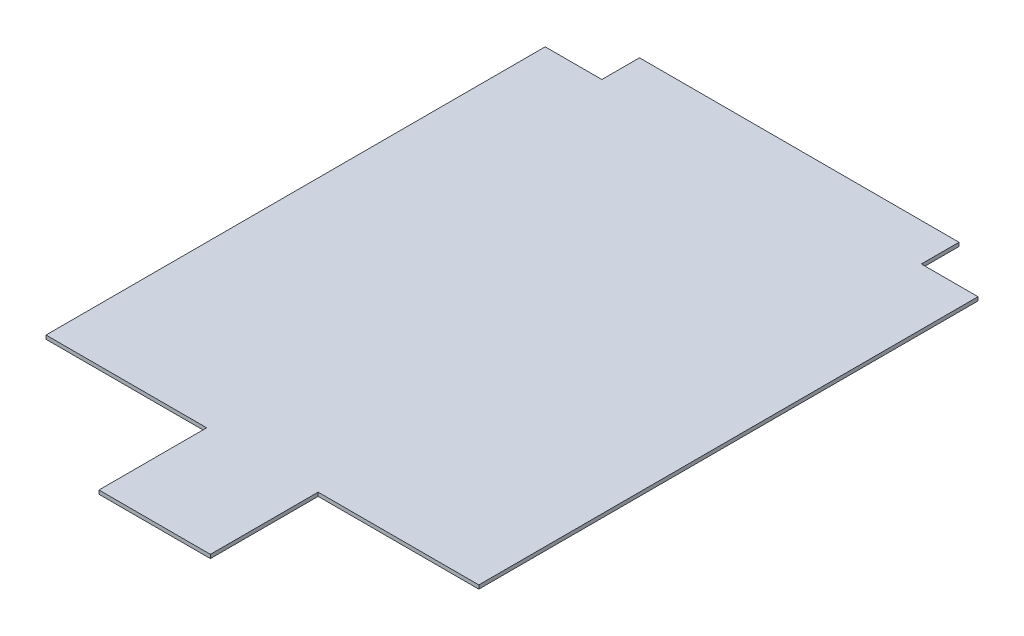
ISO-10303-21;
HEADER;
FILE_DESCRIPTION(('STEP AP214'),'2;1');
FILE_NAME('part.step','',(''),(''),'','','');
FILE_SCHEMA(('AUTOMOTIVE_DESIGN { 1 0 10303 214 1 1 1 1 }'));
ENDSEC;
DATA;
#1=APPLICATION_CONTEXT('core data for automotive mechanical design processes');
#2=APPLICATION_PROTOCOL_DEFINITION('international standard','automotive_design',2000,#1);
#3=PRODUCT_CONTEXT('',#1,'mechanical');
#4=PRODUCT('Part','Part','',(#3));
#5=PRODUCT_RELATED_PRODUCT_CATEGORY('part','',(#4));
#6=PRODUCT_DEFINITION_FORMATION('','',#4);
#7=PRODUCT_DEFINITION_CONTEXT('part definition',#1,'design');
#8=PRODUCT_DEFINITION('design','',#6,#7);
#9=PRODUCT_DEFINITION_SHAPE('','',#8);
#10=(LENGTH_UNIT() NAMED_UNIT(*) SI_UNIT(.MILLI.,.METRE.));
#11=(NAMED_UNIT(*) PLANE_ANGLE_UNIT() SI_UNIT($,.RADIAN.));
#12=(NAMED_UNIT(*) SI_UNIT($,.STERADIAN.) SOLID_ANGLE_UNIT());
#13=UNCERTAINTY_MEASURE_WITH_UNIT(LENGTH_MEASURE(1.E-05),#10,'distance_accuracy_value','');
#14=(GEOMETRIC_REPRESENTATION_CONTEXT(3) GLOBAL_UNCERTAINTY_ASSIGNED_CONTEXT((#13)) GLOBAL_UNIT_ASSIGNED_CONTEXT((#10,
#11,#12)) REPRESENTATION_CONTEXT('',''));
#15=CARTESIAN_POINT('',(0.,0.,0.));
#16=DIRECTION('',(0.,0.,1.));
#17=DIRECTION('',(1.,0.,0.));
#18=AXIS2_PLACEMENT_3D('',#15,#16,#17);
#19=CARTESIAN_POINT('',(51.7651599296806,0.5,0.));
#20=DIRECTION('',(1.,0.,0.));
#21=DIRECTION('',(0.,0.,-1.));
#22=AXIS2_PLACEMENT_3D('',#19,#20,#21);
#23=PLANE('',#22);
#24=DIRECTION('',(0.,0.,1.));
#25=VECTOR('',#24,1.);
#26=CARTESIAN_POINT('',(51.7651599296806,-0.5,0.));
#27=LINE('',#26,#25);
#28=CARTESIAN_POINT('',(51.7651599296806,-0.5,-74.0509841427275));
#29=VERTEX_POINT('',#28);
#30=CARTESIAN_POINT('',(51.7651599296806,-0.5,60.3183826816136));
#31=VERTEX_POINT('',#30);
#32=EDGE_CURVE('E167',#29,#31,#27,.T.);
#33=ORIENTED_EDGE('',*,*,#32,.F.);
#34=DIRECTION('',(0.,-1.,0.));
#35=VECTOR('',#34,1.);
#36=CARTESIAN_POINT('',(51.7651599296806,0.5,-74.0509841427275));
#37=LINE('',#36,#35);
#38=CARTESIAN_POINT('',(51.7651599296806,0.5,-74.0509841427275));
#39=VERTEX_POINT('',#38);
#40=EDGE_CURVE('E11',#39,#29,#37,.T.);
#41=ORIENTED_EDGE('',*,*,#40,.F.);
#42=DIRECTION('',(0.,0.,1.));
#43=VECTOR('',#42,1.);
#44=CARTESIAN_POINT('',(51.7651599296806,0.5,0.));
#45=LINE('',#44,#43);
#46=CARTESIAN_POINT('',(51.7651599296806,0.5,60.3183826816136));
#47=VERTEX_POINT('',#46);
#48=EDGE_CURVE('E211',#39,#47,#45,.T.);
#49=ORIENTED_EDGE('',*,*,#48,.T.);
#50=DIRECTION('',(0.,-1.,0.));
#51=VECTOR('',#50,1.);
#52=CARTESIAN_POINT('',(51.7651599296806,0.5,60.3183826816136));
#53=LINE('',#52,#51);
#54=EDGE_CURVE('E108',#47,#31,#53,.T.);
#55=ORIENTED_EDGE('',*,*,#54,.T.);
#56=EDGE_LOOP('',(#33,#41,#49,#55));
#57=FACE_BOUND('',#56,.T.);
#58=ADVANCED_FACE('F45',(#57),#23,.T.);
#59=CARTESIAN_POINT('',(0.,0.5,-74.0509841427275));
#60=DIRECTION('',(0.,0.,-1.));
#61=DIRECTION('',(-1.,0.,0.));
#62=AXIS2_PLACEMENT_3D('',#59,#60,#61);
#63=PLANE('',#62);
#64=DIRECTION('',(1.,0.,0.));
#65=VECTOR('',#64,1.);
#66=CARTESIAN_POINT('',(0.,-0.5,-74.0509841427275));
#67=LINE('',#66,#65);
#68=CARTESIAN_POINT('',(36.5151599296805,-0.5,-74.0509841427275));
#69=VERTEX_POINT('',#68);
#70=EDGE_CURVE('E171',#69,#29,#67,.T.);
#71=ORIENTED_EDGE('',*,*,#70,.F.);
#72=DIRECTION('',(0.,-1.,0.));
#73=VECTOR('',#72,1.);
#74=CARTESIAN_POINT('',(36.5151599296805,0.5,-74.0509841427275));
#75=LINE('',#74,#73);
#76=CARTESIAN_POINT('',(36.5151599296805,0.5,-74.0509841427275));
#77=VERTEX_POINT('',#76);
#78=EDGE_CURVE('E54',#77,#69,#75,.T.);
#79=ORIENTED_EDGE('',*,*,#78,.F.);
#80=DIRECTION('',(1.,0.,0.));
#81=VECTOR('',#80,1.);
#82=CARTESIAN_POINT('',(0.,0.5,-74.0509841427275));
#83=LINE('',#82,#81);
#84=EDGE_CURVE('E250',#77,#39,#83,.T.);
#85=ORIENTED_EDGE('',*,*,#84,.T.);
#86=ORIENTED_EDGE('',*,*,#40,.T.);
#87=EDGE_LOOP('',(#71,#79,#85,#86));
#88=FACE_BOUND('',#87,.T.);
#89=ADVANCED_FACE('F249',(#88),#63,.T.);
#90=CARTESIAN_POINT('',(36.5151599296804,0.5,0.));
#91=DIRECTION('',(-1.,0.,0.));
#92=DIRECTION('',(0.,0.,1.));
#93=AXIS2_PLACEMENT_3D('',#90,#91,#92);
#94=PLANE('',#93);
#95=DIRECTION('',(0.,0.,-1.));
#96=VECTOR('',#95,1.);
#97=CARTESIAN_POINT('',(36.5151599296804,-0.5,0.));
#98=LINE('',#97,#96);
#99=CARTESIAN_POINT('',(36.5151599296805,-0.5,-84.1830841388319));
#100=VERTEX_POINT('',#99);
#101=EDGE_CURVE('E175',#69,#100,#98,.T.);
#102=ORIENTED_EDGE('',*,*,#101,.T.);
#103=DIRECTION('',(0.,-1.,0.));
#104=VECTOR('',#103,1.);
#105=CARTESIAN_POINT('',(36.5151599296805,0.5,-84.1830841388319));
#106=LINE('',#105,#104);
#107=CARTESIAN_POINT('',(36.5151599296805,0.5,-84.1830841388319));
#108=VERTEX_POINT('',#107);
#109=EDGE_CURVE('E233',#108,#100,#106,.T.);
#110=ORIENTED_EDGE('',*,*,#109,.F.);
#111=DIRECTION('',(0.,0.,-1.));
#112=VECTOR('',#111,1.);
#113=CARTESIAN_POINT('',(36.5151599296804,0.5,0.));
#114=LINE('',#113,#112);
#115=EDGE_CURVE('E241',#77,#108,#114,.T.);
#116=ORIENTED_EDGE('',*,*,#115,.F.);
#117=ORIENTED_EDGE('',*,*,#78,.T.);
#118=EDGE_LOOP('',(#102,#110,#116,#117));
#119=FACE_BOUND('',#118,.T.);
#120=ADVANCED_FACE('F239',(#119),#94,.F.);
#121=CARTESIAN_POINT('',(0.,0.5,-84.1830841388319));
#122=DIRECTION('',(0.,0.,-1.));
#123=DIRECTION('',(-1.,0.,0.));
#124=AXIS2_PLACEMENT_3D('',#121,#122,#123);
#125=PLANE('',#124);
#126=DIRECTION('',(1.,0.,0.));
#127=VECTOR('',#126,1.);
#128=CARTESIAN_POINT('',(0.,-0.5,-84.1830841388319));
#129=LINE('',#128,#127);
#130=CARTESIAN_POINT('',(-49.4848400703195,-0.5,-84.1830841388319));
#131=VERTEX_POINT('',#130);
#132=EDGE_CURVE('E179',#131,#100,#129,.T.);
#133=ORIENTED_EDGE('',*,*,#132,.F.);
#134=DIRECTION('',(0.,-1.,0.));
#135=VECTOR('',#134,1.);
#136=CARTESIAN_POINT('',(-49.4848400703195,0.5,-84.1830841388319));
#137=LINE('',#136,#135);
#138=CARTESIAN_POINT('',(-49.4848400703195,0.5,-84.1830841388319));
#139=VERTEX_POINT('',#138);
#140=EDGE_CURVE('E230',#139,#131,#137,.T.);
#141=ORIENTED_EDGE('',*,*,#140,.F.);
#142=DIRECTION('',(1.,0.,0.));
#143=VECTOR('',#142,1.);
#144=CARTESIAN_POINT('',(0.,0.5,-84.1830841388319));
#145=LINE('',#144,#143);
#146=EDGE_CURVE('E259',#139,#108,#145,.T.);
#147=ORIENTED_EDGE('',*,*,#146,.T.);
#148=ORIENTED_EDGE('',*,*,#109,.T.);
#149=EDGE_LOOP('',(#133,#141,#147,#148));
#150=FACE_BOUND('',#149,.T.);
#151=ADVANCED_FACE('F299',(#150),#125,.T.);
#152=CARTESIAN_POINT('',(-49.4848400703195,0.5,0.));
#153=DIRECTION('',(-1.,0.,0.));
#154=DIRECTION('',(0.,0.,1.));
#155=AXIS2_PLACEMENT_3D('',#152,#153,#154);
#156=PLANE('',#155);
#157=DIRECTION('',(0.,0.,-1.));
#158=VECTOR('',#157,1.);
#159=CARTESIAN_POINT('',(-49.4848400703195,-0.5,0.));
#160=LINE('',#159,#158);
#161=CARTESIAN_POINT('',(-49.4848400703195,-0.5,-74.0509841427275));
#162=VERTEX_POINT('',#161);
#163=EDGE_CURVE('E183',#162,#131,#160,.T.);
#164=ORIENTED_EDGE('',*,*,#163,.F.);
#165=DIRECTION('',(0.,-1.,0.));
#166=VECTOR('',#165,1.);
#167=CARTESIAN_POINT('',(-49.4848400703195,0.5,-74.0509841427275));
#168=LINE('',#167,#166);
#169=CARTESIAN_POINT('',(-49.4848400703195,0.5,-74.0509841427275));
#170=VERTEX_POINT('',#169);
#171=EDGE_CURVE('E227',#170,#162,#168,.T.);
#172=ORIENTED_EDGE('',*,*,#171,.F.);
#173=DIRECTION('',(0.,0.,-1.));
#174=VECTOR('',#173,1.);
#175=CARTESIAN_POINT('',(-49.4848400703195,0.5,0.));
#176=LINE('',#175,#174);
#177=EDGE_CURVE('E263',#170,#139,#176,.T.);
#178=ORIENTED_EDGE('',*,*,#177,.T.);
#179=ORIENTED_EDGE('',*,*,#140,.T.);
#180=EDGE_LOOP('',(#164,#172,#178,#179));
#181=FACE_BOUND('',#180,.T.);
#182=ADVANCED_FACE('F295',(#181),#156,.T.);
#183=CARTESIAN_POINT('',(0.,0.5,-74.0509841427275));
#184=DIRECTION('',(0.,0.,-1.));
#185=DIRECTION('',(-1.,0.,0.));
#186=AXIS2_PLACEMENT_3D('',#183,#184,#185);
#187=PLANE('',#186);
#188=DIRECTION('',(1.,0.,0.));
#189=VECTOR('',#188,1.);
#190=CARTESIAN_POINT('',(0.,-0.5,-74.0509841427275));
#191=LINE('',#190,#189);
#192=CARTESIAN_POINT('',(-64.7348400703194,-0.5,-74.0509841427275));
#193=VERTEX_POINT('',#192);
#194=EDGE_CURVE('E187',#193,#162,#191,.T.);
#195=ORIENTED_EDGE('',*,*,#194,.F.);
#196=DIRECTION('',(0.,-1.,0.));
#197=VECTOR('',#196,1.);
#198=CARTESIAN_POINT('',(-64.7348400703194,0.5,-74.0509841427275));
#199=LINE('',#198,#197);
#200=CARTESIAN_POINT('',(-64.7348400703194,0.5,-74.0509841427275));
#201=VERTEX_POINT('',#200);
#202=EDGE_CURVE('E224',#201,#193,#199,.T.);
#203=ORIENTED_EDGE('',*,*,#202,.F.);
#204=DIRECTION('',(1.,0.,0.));
#205=VECTOR('',#204,1.);
#206=CARTESIAN_POINT('',(0.,0.5,-74.0509841427275));
#207=LINE('',#206,#205);
#208=EDGE_CURVE('E267',#201,#170,#207,.T.);
#209=ORIENTED_EDGE('',*,*,#208,.T.);
#210=ORIENTED_EDGE('',*,*,#171,.T.);
#211=EDGE_LOOP('',(#195,#203,#209,#210));
#212=FACE_BOUND('',#211,.T.);
#213=ADVANCED_FACE('F292',(#212),#187,.T.);
#214=CARTESIAN_POINT('',(-64.7348400703194,0.5,0.));
#215=DIRECTION('',(-1.,0.,0.));
#216=DIRECTION('',(0.,0.,1.));
#217=AXIS2_PLACEMENT_3D('',#214,#215,#216);
#218=PLANE('',#217);
#219=DIRECTION('',(0.,0.,-1.));
#220=VECTOR('',#219,1.);
#221=CARTESIAN_POINT('',(-64.7348400703194,-0.5,0.));
#222=LINE('',#221,#220);
#223=CARTESIAN_POINT('',(-64.7348400703194,-0.5,60.3183826816136));
#224=VERTEX_POINT('',#223);
#225=EDGE_CURVE('E191',#224,#193,#222,.T.);
#226=ORIENTED_EDGE('',*,*,#225,.F.);
#227=DIRECTION('',(0.,-1.,0.));
#228=VECTOR('',#227,1.);
#229=CARTESIAN_POINT('',(-64.7348400703194,0.5,60.3183826816136));
#230=LINE('',#229,#228);
#231=CARTESIAN_POINT('',(-64.7348400703194,0.5,60.3183826816136));
#232=VERTEX_POINT('',#231);
#233=EDGE_CURVE('E221',#232,#224,#230,.T.);
#234=ORIENTED_EDGE('',*,*,#233,.F.);
#235=DIRECTION('',(0.,0.,-1.));
#236=VECTOR('',#235,1.);
#237=CARTESIAN_POINT('',(-64.7348400703194,0.5,0.));
#238=LINE('',#237,#236);
#239=EDGE_CURVE('E271',#232,#201,#238,.T.);
#240=ORIENTED_EDGE('',*,*,#239,.T.);
#241=ORIENTED_EDGE('',*,*,#202,.T.);
#242=EDGE_LOOP('',(#226,#234,#240,#241));
#243=FACE_BOUND('',#242,.T.);
#244=ADVANCED_FACE('F288',(#243),#218,.T.);
#245=CARTESIAN_POINT('',(0.,0.5,60.3183826816136));
#246=DIRECTION('',(0.,0.,1.));
#247=DIRECTION('',(1.,0.,0.));
#248=AXIS2_PLACEMENT_3D('',#245,#246,#247);
#249=PLANE('',#248);
#250=DIRECTION('',(-1.,0.,0.));
#251=VECTOR('',#250,1.);
#252=CARTESIAN_POINT('',(0.,-0.5,60.3183826816136));
#253=LINE('',#252,#251);
#254=CARTESIAN_POINT('',(-21.4848400703194,-0.5,60.3183826816136));
#255=VERTEX_POINT('',#254);
#256=EDGE_CURVE('E195',#255,#224,#253,.T.);
#257=ORIENTED_EDGE('',*,*,#256,.F.);
#258=DIRECTION('',(0.,-1.,0.));
#259=VECTOR('',#258,1.);
#260=CARTESIAN_POINT('',(-21.4848400703194,0.5,60.3183826816136));
#261=LINE('',#260,#259);
#262=CARTESIAN_POINT('',(-21.4848400703194,0.5,60.3183826816136));
#263=VERTEX_POINT('',#262);
#264=EDGE_CURVE('E218',#263,#255,#261,.T.);
#265=ORIENTED_EDGE('',*,*,#264,.F.);
#266=DIRECTION('',(-1.,0.,0.));
#267=VECTOR('',#266,1.);
#268=CARTESIAN_POINT('',(0.,0.5,60.3183826816136));
#269=LINE('',#268,#267);
#270=EDGE_CURVE('E275',#263,#232,#269,.T.);
#271=ORIENTED_EDGE('',*,*,#270,.T.);
#272=ORIENTED_EDGE('',*,*,#233,.T.);
#273=EDGE_LOOP('',(#257,#265,#271,#272));
#274=FACE_BOUND('',#273,.T.);
#275=ADVANCED_FACE('F285',(#274),#249,.T.);
#276=CARTESIAN_POINT('',(-21.4848400703194,0.5,0.));
#277=DIRECTION('',(-1.,0.,0.));
#278=DIRECTION('',(0.,0.,1.));
#279=AXIS2_PLACEMENT_3D('',#276,#277,#278);
#280=PLANE('',#279);
#281=DIRECTION('',(0.,0.,-1.));
#282=VECTOR('',#281,1.);
#283=CARTESIAN_POINT('',(-21.4848400703194,-0.5,0.));
#284=LINE('',#283,#282);
#285=CARTESIAN_POINT('',(-21.4848400703194,-0.5,89.3169158611681));
#286=VERTEX_POINT('',#285);
#287=EDGE_CURVE('E199',#286,#255,#284,.T.);
#288=ORIENTED_EDGE('',*,*,#287,.F.);
#289=DIRECTION('',(0.,-1.,0.));
#290=VECTOR('',#289,1.);
#291=CARTESIAN_POINT('',(-21.4848400703194,0.5,89.3169158611681));
#292=LINE('',#291,#290);
#293=CARTESIAN_POINT('',(-21.4848400703194,0.5,89.3169158611681));
#294=VERTEX_POINT('',#293);
#295=EDGE_CURVE('E150',#294,#286,#292,.T.);
#296=ORIENTED_EDGE('',*,*,#295,.F.);
#297=DIRECTION('',(0.,0.,-1.));
#298=VECTOR('',#297,1.);
#299=CARTESIAN_POINT('',(-21.4848400703194,0.5,0.));
#300=LINE('',#299,#298);
#301=EDGE_CURVE('E157',#294,#263,#300,.T.);
#302=ORIENTED_EDGE('',*,*,#301,.T.);
#303=ORIENTED_EDGE('',*,*,#264,.T.);
#304=EDGE_LOOP('',(#288,#296,#302,#303));
#305=FACE_BOUND('',#304,.T.);
#306=ADVANCED_FACE('F281',(#305),#280,.T.);
#307=CARTESIAN_POINT('',(0.,0.5,89.3169158611681));
#308=DIRECTION('',(0.,0.,1.));
#309=DIRECTION('',(1.,0.,0.));
#310=AXIS2_PLACEMENT_3D('',#307,#308,#309);
#311=PLANE('',#310);
#312=DIRECTION('',(-1.,0.,0.));
#313=VECTOR('',#312,1.);
#314=CARTESIAN_POINT('',(0.,-0.5,89.3169158611681));
#315=LINE('',#314,#313);
#316=CARTESIAN_POINT('',(8.51515992968059,-0.5,89.3169158611681));
#317=VERTEX_POINT('',#316);
#318=EDGE_CURVE('E144',#317,#286,#315,.T.);
#319=ORIENTED_EDGE('',*,*,#318,.F.);
#320=DIRECTION('',(0.,-1.,0.));
#321=VECTOR('',#320,1.);
#322=CARTESIAN_POINT('',(8.51515992968059,0.5,89.3169158611681));
#323=LINE('',#322,#321);
#324=CARTESIAN_POINT('',(8.51515992968059,0.5,89.3169158611681));
#325=VERTEX_POINT('',#324);
#326=EDGE_CURVE('E139',#325,#317,#323,.T.);
#327=ORIENTED_EDGE('',*,*,#326,.F.);
#328=DIRECTION('',(-1.,0.,0.));
#329=VECTOR('',#328,1.);
#330=CARTESIAN_POINT('',(0.,0.5,89.3169158611681));
#331=LINE('',#330,#329);
#332=EDGE_CURVE('E142',#325,#294,#331,.T.);
#333=ORIENTED_EDGE('',*,*,#332,.T.);
#334=ORIENTED_EDGE('',*,*,#295,.T.);
#335=EDGE_LOOP('',(#319,#327,#333,#334));
#336=FACE_BOUND('',#335,.T.);
#337=ADVANCED_FACE('F141',(#336),#311,.T.);
#338=CARTESIAN_POINT('',(8.51515992968059,0.5,0.));
#339=DIRECTION('',(1.,0.,0.));
#340=DIRECTION('',(0.,0.,-1.));
#341=AXIS2_PLACEMENT_3D('',#338,#339,#340);
#342=PLANE('',#341);
#343=DIRECTION('',(0.,0.,1.));
#344=VECTOR('',#343,1.);
#345=CARTESIAN_POINT('',(8.51515992968059,-0.5,0.));
#346=LINE('',#345,#344);
#347=CARTESIAN_POINT('',(8.51515992968059,-0.5,60.3183826816136));
#348=VERTEX_POINT('',#347);
#349=EDGE_CURVE('E205',#348,#317,#346,.T.);
#350=ORIENTED_EDGE('',*,*,#349,.F.);
#351=DIRECTION('',(0.,-1.,0.));
#352=VECTOR('',#351,1.);
#353=CARTESIAN_POINT('',(8.51515992968059,0.5,60.3183826816136));
#354=LINE('',#353,#352);
#355=CARTESIAN_POINT('',(8.51515992968059,0.5,60.3183826816136));
#356=VERTEX_POINT('',#355);
#357=EDGE_CURVE('E101',#356,#348,#354,.T.);
#358=ORIENTED_EDGE('',*,*,#357,.F.);
#359=DIRECTION('',(0.,0.,1.));
#360=VECTOR('',#359,1.);
#361=CARTESIAN_POINT('',(8.51515992968059,0.5,0.));
#362=LINE('',#361,#360);
#363=EDGE_CURVE('E154',#356,#325,#362,.T.);
#364=ORIENTED_EDGE('',*,*,#363,.T.);
#365=ORIENTED_EDGE('',*,*,#326,.T.);
#366=EDGE_LOOP('',(#350,#358,#364,#365));
#367=FACE_BOUND('',#366,.T.);
#368=ADVANCED_FACE('F160',(#367),#342,.T.);
#369=CARTESIAN_POINT('',(0.,0.5,60.3183826816136));
#370=DIRECTION('',(0.,0.,-1.));
#371=DIRECTION('',(-1.,0.,0.));
#372=AXIS2_PLACEMENT_3D('',#369,#370,#371);
#373=PLANE('',#372);
#374=DIRECTION('',(1.,0.,0.));
#375=VECTOR('',#374,1.);
#376=CARTESIAN_POINT('',(0.,-0.5,60.3183826816136));
#377=LINE('',#376,#375);
#378=EDGE_CURVE('E208',#348,#31,#377,.T.);
#379=ORIENTED_EDGE('',*,*,#378,.T.);
#380=ORIENTED_EDGE('',*,*,#54,.F.);
#381=DIRECTION('',(1.,0.,0.));
#382=VECTOR('',#381,1.);
#383=CARTESIAN_POINT('',(0.,0.5,60.3183826816136));
#384=LINE('',#383,#382);
#385=EDGE_CURVE('E62',#356,#47,#384,.T.);
#386=ORIENTED_EDGE('',*,*,#385,.F.);
#387=ORIENTED_EDGE('',*,*,#357,.T.);
#388=EDGE_LOOP('',(#379,#380,#386,#387));
#389=FACE_BOUND('',#388,.T.);
#390=ADVANCED_FACE('F251',(#389),#373,.F.);
#391=CARTESIAN_POINT('',(0.,0.5,0.));
#392=DIRECTION('',(0.,1.,0.));
#393=DIRECTION('',(0.,0.,1.));
#394=AXIS2_PLACEMENT_3D('',#391,#392,#393);
#395=PLANE('',#394);
#396=ORIENTED_EDGE('',*,*,#48,.F.);
#397=ORIENTED_EDGE('',*,*,#84,.F.);
#398=ORIENTED_EDGE('',*,*,#115,.T.);
#399=ORIENTED_EDGE('',*,*,#146,.F.);
#400=ORIENTED_EDGE('',*,*,#177,.F.);
#401=ORIENTED_EDGE('',*,*,#208,.F.);
#402=ORIENTED_EDGE('',*,*,#239,.F.);
#403=ORIENTED_EDGE('',*,*,#270,.F.);
#404=ORIENTED_EDGE('',*,*,#301,.F.);
#405=ORIENTED_EDGE('',*,*,#332,.F.);
#406=ORIENTED_EDGE('',*,*,#363,.F.);
#407=ORIENTED_EDGE('',*,*,#385,.T.);
#408=EDGE_LOOP('',(#396,#397,#398,#399,#400,#401,#402,#403,#404,#405,#406,#407));
#409=FACE_BOUND('',#408,.T.);
#410=ADVANCED_FACE('F153',(#409),#395,.T.);
#411=CARTESIAN_POINT('',(0.,-0.5,0.));
#412=DIRECTION('',(0.,1.,0.));
#413=DIRECTION('',(0.,0.,1.));
#414=AXIS2_PLACEMENT_3D('',#411,#412,#413);
#415=PLANE('',#414);
#416=ORIENTED_EDGE('',*,*,#32,.T.);
#417=ORIENTED_EDGE('',*,*,#378,.F.);
#418=ORIENTED_EDGE('',*,*,#349,.T.);
#419=ORIENTED_EDGE('',*,*,#318,.T.);
#420=ORIENTED_EDGE('',*,*,#287,.T.);
#421=ORIENTED_EDGE('',*,*,#256,.T.);
#422=ORIENTED_EDGE('',*,*,#225,.T.);
#423=ORIENTED_EDGE('',*,*,#194,.T.);
#424=ORIENTED_EDGE('',*,*,#163,.T.);
#425=ORIENTED_EDGE('',*,*,#132,.T.);
#426=ORIENTED_EDGE('',*,*,#101,.F.);
#427=ORIENTED_EDGE('',*,*,#70,.T.);
#428=EDGE_LOOP('',(#416,#417,#418,#419,#420,#421,#422,#423,#424,#425,#426,#427));
#429=FACE_BOUND('',#428,.T.);
#430=ADVANCED_FACE('F247',(#429),#415,.F.);
#431=CLOSED_SHELL('',(#58,#89,#120,#151,#182,#213,#244,#275,#306,#337,#368,#390,#410,#430));
#432=MANIFOLD_SOLID_BREP('B2',#431);
#433=ADVANCED_BREP_SHAPE_REPRESENTATION('',(#18,#432),#14);
#434=SHAPE_DEFINITION_REPRESENTATION(#9,#433);
ENDSEC;
END-ISO-10303-21;
